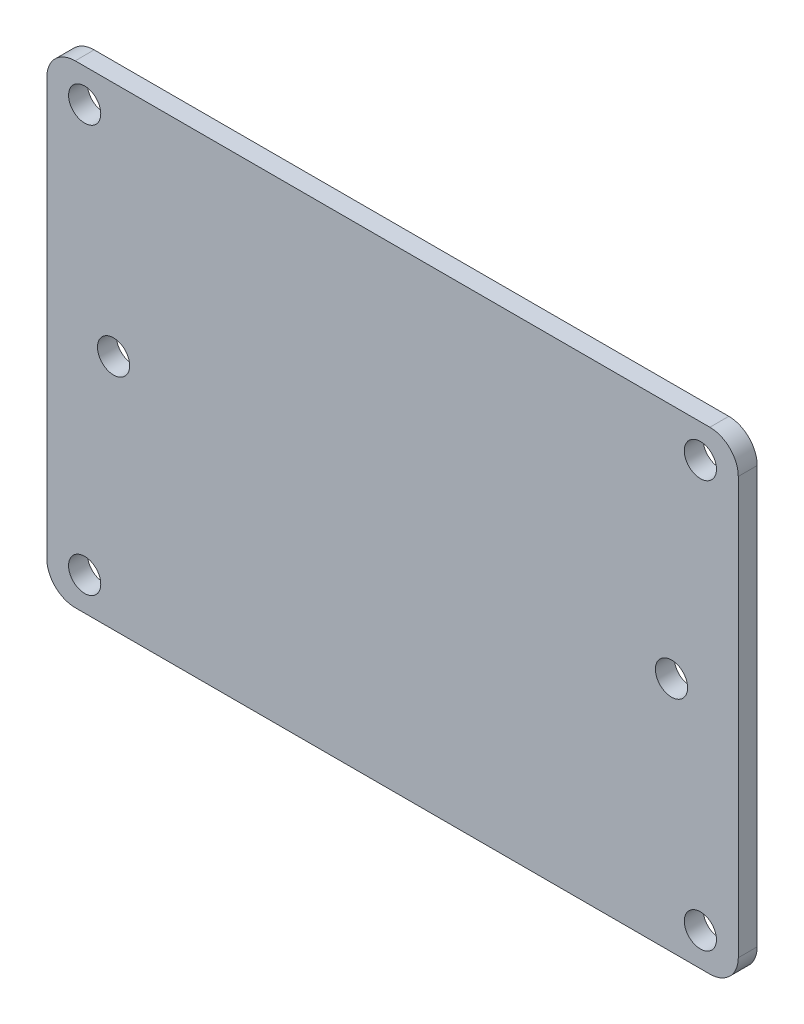
ISO-10303-21;
HEADER;
FILE_DESCRIPTION(('STEP AP214'),'2;1');
FILE_NAME('part.step','',(''),(''),'','','');
FILE_SCHEMA(('AUTOMOTIVE_DESIGN { 1 0 10303 214 1 1 1 1 }'));
ENDSEC;
DATA;
#1=APPLICATION_CONTEXT('core data for automotive mechanical design processes');
#2=APPLICATION_PROTOCOL_DEFINITION('international standard','automotive_design',2000,#1);
#3=PRODUCT_CONTEXT('',#1,'mechanical');
#4=PRODUCT('Part','Part','',(#3));
#5=PRODUCT_RELATED_PRODUCT_CATEGORY('part','',(#4));
#6=PRODUCT_DEFINITION_FORMATION('','',#4);
#7=PRODUCT_DEFINITION_CONTEXT('part definition',#1,'design');
#8=PRODUCT_DEFINITION('design','',#6,#7);
#9=PRODUCT_DEFINITION_SHAPE('','',#8);
#10=(LENGTH_UNIT() NAMED_UNIT(*) SI_UNIT(.MILLI.,.METRE.));
#11=(NAMED_UNIT(*) PLANE_ANGLE_UNIT() SI_UNIT($,.RADIAN.));
#12=(NAMED_UNIT(*) SI_UNIT($,.STERADIAN.) SOLID_ANGLE_UNIT());
#13=UNCERTAINTY_MEASURE_WITH_UNIT(LENGTH_MEASURE(1.E-05),#10,'distance_accuracy_value','');
#14=(GEOMETRIC_REPRESENTATION_CONTEXT(3) GLOBAL_UNCERTAINTY_ASSIGNED_CONTEXT((#13)) GLOBAL_UNIT_ASSIGNED_CONTEXT((#10,
#11,#12)) REPRESENTATION_CONTEXT('',''));
#15=CARTESIAN_POINT('',(0.,0.,0.));
#16=DIRECTION('',(0.,0.,1.));
#17=DIRECTION('',(1.,0.,0.));
#18=AXIS2_PLACEMENT_3D('',#15,#16,#17);
#19=CARTESIAN_POINT('',(-33.5,22.,2.));
#20=DIRECTION('',(0.,0.,1.));
#21=DIRECTION('',(1.,0.,0.));
#22=AXIS2_PLACEMENT_3D('',#19,#20,#21);
#23=PLANE('',#22);
#24=CARTESIAN_POINT('',(29.45,0.,2.));
#25=DIRECTION('',(0.,0.,1.));
#26=DIRECTION('',(1.,0.,0.));
#27=AXIS2_PLACEMENT_3D('',#24,#25,#26);
#28=CIRCLE('',#27,1.7);
#29=CARTESIAN_POINT('',(31.15,0.,2.));
#30=VERTEX_POINT('',#29);
#31=EDGE_CURVE('E224',#30,#30,#28,.F.);
#32=ORIENTED_EDGE('',*,*,#31,.T.);
#33=EDGE_LOOP('',(#32));
#34=FACE_BOUND('',#33,.T.);
#35=CARTESIAN_POINT('',(-29.45,0.,2.));
#36=DIRECTION('',(0.,0.,1.));
#37=DIRECTION('',(1.,0.,0.));
#38=AXIS2_PLACEMENT_3D('',#35,#36,#37);
#39=CIRCLE('',#38,1.7);
#40=CARTESIAN_POINT('',(-27.75,0.,2.));
#41=VERTEX_POINT('',#40);
#42=EDGE_CURVE('E221',#41,#41,#39,.F.);
#43=ORIENTED_EDGE('',*,*,#42,.T.);
#44=EDGE_LOOP('',(#43));
#45=FACE_BOUND('',#44,.T.);
#46=CARTESIAN_POINT('',(32.5,21.5,2.));
#47=DIRECTION('',(0.,0.,1.));
#48=DIRECTION('',(1.,0.,0.));
#49=AXIS2_PLACEMENT_3D('',#46,#47,#48);
#50=CIRCLE('',#49,1.7);
#51=CARTESIAN_POINT('',(34.2,21.5,2.));
#52=VERTEX_POINT('',#51);
#53=EDGE_CURVE('E212',#52,#52,#50,.T.);
#54=ORIENTED_EDGE('',*,*,#53,.F.);
#55=EDGE_LOOP('',(#54));
#56=FACE_BOUND('',#55,.T.);
#57=CARTESIAN_POINT('',(-32.5,21.5,2.));
#58=DIRECTION('',(0.,0.,1.));
#59=DIRECTION('',(1.,0.,0.));
#60=AXIS2_PLACEMENT_3D('',#57,#58,#59);
#61=CIRCLE('',#60,1.7);
#62=CARTESIAN_POINT('',(-30.8,21.5,2.));
#63=VERTEX_POINT('',#62);
#64=EDGE_CURVE('E206',#63,#63,#61,.T.);
#65=ORIENTED_EDGE('',*,*,#64,.F.);
#66=EDGE_LOOP('',(#65));
#67=FACE_BOUND('',#66,.T.);
#68=CARTESIAN_POINT('',(32.5,-21.5,2.));
#69=DIRECTION('',(0.,0.,1.));
#70=DIRECTION('',(1.,0.,0.));
#71=AXIS2_PLACEMENT_3D('',#68,#69,#70);
#72=CIRCLE('',#71,1.7);
#73=CARTESIAN_POINT('',(34.2,-21.5,2.));
#74=VERTEX_POINT('',#73);
#75=EDGE_CURVE('E197',#74,#74,#72,.T.);
#76=ORIENTED_EDGE('',*,*,#75,.F.);
#77=EDGE_LOOP('',(#76));
#78=FACE_BOUND('',#77,.T.);
#79=CARTESIAN_POINT('',(-33.5,22.,2.));
#80=DIRECTION('',(0.,0.,1.));
#81=DIRECTION('',(1.,0.,0.));
#82=AXIS2_PLACEMENT_3D('',#79,#80,#81);
#83=CIRCLE('',#82,3.);
#84=CARTESIAN_POINT('',(-33.5,25.,2.));
#85=VERTEX_POINT('',#84);
#86=CARTESIAN_POINT('',(-36.5,22.,2.));
#87=VERTEX_POINT('',#86);
#88=EDGE_CURVE('E160',#85,#87,#83,.T.);
#89=ORIENTED_EDGE('',*,*,#88,.T.);
#90=DIRECTION('',(0.,-1.,0.));
#91=VECTOR('',#90,1.);
#92=CARTESIAN_POINT('',(-36.5,22.,2.));
#93=LINE('',#92,#91);
#94=CARTESIAN_POINT('',(-36.5,-22.,2.));
#95=VERTEX_POINT('',#94);
#96=EDGE_CURVE('E108',#87,#95,#93,.T.);
#97=ORIENTED_EDGE('',*,*,#96,.T.);
#98=CARTESIAN_POINT('',(-33.5,-22.,2.));
#99=DIRECTION('',(0.,0.,1.));
#100=DIRECTION('',(-1.,0.,0.));
#101=AXIS2_PLACEMENT_3D('',#98,#99,#100);
#102=CIRCLE('',#101,3.);
#103=CARTESIAN_POINT('',(-33.5,-25.,2.));
#104=VERTEX_POINT('',#103);
#105=EDGE_CURVE('E175',#95,#104,#102,.T.);
#106=ORIENTED_EDGE('',*,*,#105,.T.);
#107=DIRECTION('',(1.,0.,0.));
#108=VECTOR('',#107,1.);
#109=CARTESIAN_POINT('',(-33.5,-25.,2.));
#110=LINE('',#109,#108);
#111=CARTESIAN_POINT('',(33.5,-25.,2.));
#112=VERTEX_POINT('',#111);
#113=EDGE_CURVE('E188',#104,#112,#110,.T.);
#114=ORIENTED_EDGE('',*,*,#113,.T.);
#115=CARTESIAN_POINT('',(33.5,-22.,2.));
#116=DIRECTION('',(0.,0.,1.));
#117=DIRECTION('',(-1.,0.,0.));
#118=AXIS2_PLACEMENT_3D('',#115,#116,#117);
#119=CIRCLE('',#118,3.00000000000001);
#120=CARTESIAN_POINT('',(36.5,-22.,2.));
#121=VERTEX_POINT('',#120);
#122=EDGE_CURVE('E127',#112,#121,#119,.T.);
#123=ORIENTED_EDGE('',*,*,#122,.T.);
#124=DIRECTION('',(0.,1.,0.));
#125=VECTOR('',#124,1.);
#126=CARTESIAN_POINT('',(36.5,22.,2.));
#127=LINE('',#126,#125);
#128=CARTESIAN_POINT('',(36.5,22.,2.));
#129=VERTEX_POINT('',#128);
#130=EDGE_CURVE('E121',#121,#129,#127,.T.);
#131=ORIENTED_EDGE('',*,*,#130,.T.);
#132=CARTESIAN_POINT('',(33.5,22.,2.));
#133=DIRECTION('',(0.,0.,1.));
#134=DIRECTION('',(-1.,0.,0.));
#135=AXIS2_PLACEMENT_3D('',#132,#133,#134);
#136=CIRCLE('',#135,2.99999999999999);
#137=CARTESIAN_POINT('',(33.5,25.,2.));
#138=VERTEX_POINT('',#137);
#139=EDGE_CURVE('E125',#129,#138,#136,.T.);
#140=ORIENTED_EDGE('',*,*,#139,.T.);
#141=DIRECTION('',(-1.,0.,0.));
#142=VECTOR('',#141,1.);
#143=CARTESIAN_POINT('',(-33.5,25.,2.));
#144=LINE('',#143,#142);
#145=EDGE_CURVE('E65',#138,#85,#144,.T.);
#146=ORIENTED_EDGE('',*,*,#145,.T.);
#147=EDGE_LOOP('',(#89,#97,#106,#114,#123,#131,#140,#146));
#148=FACE_BOUND('',#147,.T.);
#149=CARTESIAN_POINT('',(-32.5,-21.5,2.));
#150=DIRECTION('',(0.,0.,1.));
#151=DIRECTION('',(1.,0.,0.));
#152=AXIS2_PLACEMENT_3D('',#149,#150,#151);
#153=CIRCLE('',#152,1.7);
#154=CARTESIAN_POINT('',(-30.8,-21.5,2.));
#155=VERTEX_POINT('',#154);
#156=EDGE_CURVE('E149',#155,#155,#153,.T.);
#157=ORIENTED_EDGE('',*,*,#156,.F.);
#158=EDGE_LOOP('',(#157));
#159=FACE_BOUND('',#158,.T.);
#160=ADVANCED_FACE('F47',(#34,#45,#56,#67,#78,#148,#159),#23,.T.);
#161=CARTESIAN_POINT('',(-33.5,22.,0.));
#162=DIRECTION('',(0.,0.,1.));
#163=DIRECTION('',(1.,0.,0.));
#164=AXIS2_PLACEMENT_3D('',#161,#162,#163);
#165=PLANE('',#164);
#166=CARTESIAN_POINT('',(29.45,0.,0.));
#167=DIRECTION('',(0.,0.,-1.));
#168=DIRECTION('',(-1.,0.,0.));
#169=AXIS2_PLACEMENT_3D('',#166,#167,#168);
#170=CIRCLE('',#169,1.7);
#171=CARTESIAN_POINT('',(27.75,0.,0.));
#172=VERTEX_POINT('',#171);
#173=EDGE_CURVE('E215',#172,#172,#170,.T.);
#174=ORIENTED_EDGE('',*,*,#173,.F.);
#175=EDGE_LOOP('',(#174));
#176=FACE_BOUND('',#175,.T.);
#177=CARTESIAN_POINT('',(-29.45,0.,0.));
#178=DIRECTION('',(0.,0.,-1.));
#179=DIRECTION('',(-1.,0.,0.));
#180=AXIS2_PLACEMENT_3D('',#177,#178,#179);
#181=CIRCLE('',#180,1.7);
#182=CARTESIAN_POINT('',(-31.15,0.,0.));
#183=VERTEX_POINT('',#182);
#184=EDGE_CURVE('E218',#183,#183,#181,.T.);
#185=ORIENTED_EDGE('',*,*,#184,.F.);
#186=EDGE_LOOP('',(#185));
#187=FACE_BOUND('',#186,.T.);
#188=CARTESIAN_POINT('',(32.5,21.5,0.));
#189=DIRECTION('',(0.,0.,1.));
#190=DIRECTION('',(1.,0.,0.));
#191=AXIS2_PLACEMENT_3D('',#188,#189,#190);
#192=CIRCLE('',#191,1.7);
#193=CARTESIAN_POINT('',(34.2,21.5,0.));
#194=VERTEX_POINT('',#193);
#195=EDGE_CURVE('E209',#194,#194,#192,.T.);
#196=ORIENTED_EDGE('',*,*,#195,.T.);
#197=EDGE_LOOP('',(#196));
#198=FACE_BOUND('',#197,.T.);
#199=CARTESIAN_POINT('',(-32.5,21.5,0.));
#200=DIRECTION('',(0.,0.,1.));
#201=DIRECTION('',(1.,0.,0.));
#202=AXIS2_PLACEMENT_3D('',#199,#200,#201);
#203=CIRCLE('',#202,1.7);
#204=CARTESIAN_POINT('',(-30.8,21.5,0.));
#205=VERTEX_POINT('',#204);
#206=EDGE_CURVE('E205',#205,#205,#203,.T.);
#207=ORIENTED_EDGE('',*,*,#206,.T.);
#208=EDGE_LOOP('',(#207));
#209=FACE_BOUND('',#208,.T.);
#210=CARTESIAN_POINT('',(32.5,-21.5,0.));
#211=DIRECTION('',(0.,0.,1.));
#212=DIRECTION('',(1.,0.,0.));
#213=AXIS2_PLACEMENT_3D('',#210,#211,#212);
#214=CIRCLE('',#213,1.7);
#215=CARTESIAN_POINT('',(34.2,-21.5,0.));
#216=VERTEX_POINT('',#215);
#217=EDGE_CURVE('E202',#216,#216,#214,.T.);
#218=ORIENTED_EDGE('',*,*,#217,.T.);
#219=EDGE_LOOP('',(#218));
#220=FACE_BOUND('',#219,.T.);
#221=CARTESIAN_POINT('',(-33.5,22.,0.));
#222=DIRECTION('',(0.,0.,1.));
#223=DIRECTION('',(1.,0.,0.));
#224=AXIS2_PLACEMENT_3D('',#221,#222,#223);
#225=CIRCLE('',#224,3.);
#226=CARTESIAN_POINT('',(-33.5,25.,0.));
#227=VERTEX_POINT('',#226);
#228=CARTESIAN_POINT('',(-36.5,22.,0.));
#229=VERTEX_POINT('',#228);
#230=EDGE_CURVE('E145',#227,#229,#225,.T.);
#231=ORIENTED_EDGE('',*,*,#230,.F.);
#232=DIRECTION('',(-1.,0.,0.));
#233=VECTOR('',#232,1.);
#234=CARTESIAN_POINT('',(-33.5,25.,0.));
#235=LINE('',#234,#233);
#236=CARTESIAN_POINT('',(33.5,25.,0.));
#237=VERTEX_POINT('',#236);
#238=EDGE_CURVE('E100',#237,#227,#235,.T.);
#239=ORIENTED_EDGE('',*,*,#238,.F.);
#240=CARTESIAN_POINT('',(33.5,22.,0.));
#241=DIRECTION('',(0.,0.,1.));
#242=DIRECTION('',(-1.,0.,0.));
#243=AXIS2_PLACEMENT_3D('',#240,#241,#242);
#244=CIRCLE('',#243,2.99999999999999);
#245=CARTESIAN_POINT('',(36.5,22.,0.));
#246=VERTEX_POINT('',#245);
#247=EDGE_CURVE('E94',#246,#237,#244,.T.);
#248=ORIENTED_EDGE('',*,*,#247,.F.);
#249=DIRECTION('',(0.,1.,0.));
#250=VECTOR('',#249,1.);
#251=CARTESIAN_POINT('',(36.5,22.,0.));
#252=LINE('',#251,#250);
#253=CARTESIAN_POINT('',(36.5,-22.,0.));
#254=VERTEX_POINT('',#253);
#255=EDGE_CURVE('E135',#254,#246,#252,.T.);
#256=ORIENTED_EDGE('',*,*,#255,.F.);
#257=CARTESIAN_POINT('',(33.5,-22.,0.));
#258=DIRECTION('',(0.,0.,1.));
#259=DIRECTION('',(-1.,0.,0.));
#260=AXIS2_PLACEMENT_3D('',#257,#258,#259);
#261=CIRCLE('',#260,3.00000000000001);
#262=CARTESIAN_POINT('',(33.5,-25.,0.));
#263=VERTEX_POINT('',#262);
#264=EDGE_CURVE('E155',#263,#254,#261,.T.);
#265=ORIENTED_EDGE('',*,*,#264,.F.);
#266=DIRECTION('',(1.,0.,0.));
#267=VECTOR('',#266,1.);
#268=CARTESIAN_POINT('',(-33.5,-25.,0.));
#269=LINE('',#268,#267);
#270=CARTESIAN_POINT('',(-33.5,-25.,0.));
#271=VERTEX_POINT('',#270);
#272=EDGE_CURVE('E153',#271,#263,#269,.T.);
#273=ORIENTED_EDGE('',*,*,#272,.F.);
#274=CARTESIAN_POINT('',(-33.5,-22.,0.));
#275=DIRECTION('',(0.,0.,1.));
#276=DIRECTION('',(-1.,0.,0.));
#277=AXIS2_PLACEMENT_3D('',#274,#275,#276);
#278=CIRCLE('',#277,3.);
#279=CARTESIAN_POINT('',(-36.5,-22.,0.));
#280=VERTEX_POINT('',#279);
#281=EDGE_CURVE('E151',#280,#271,#278,.T.);
#282=ORIENTED_EDGE('',*,*,#281,.F.);
#283=DIRECTION('',(0.,-1.,0.));
#284=VECTOR('',#283,1.);
#285=CARTESIAN_POINT('',(-36.5,22.,0.));
#286=LINE('',#285,#284);
#287=EDGE_CURVE('E148',#229,#280,#286,.T.);
#288=ORIENTED_EDGE('',*,*,#287,.F.);
#289=EDGE_LOOP('',(#231,#239,#248,#256,#265,#273,#282,#288));
#290=FACE_BOUND('',#289,.T.);
#291=CARTESIAN_POINT('',(-32.5,-21.5,0.));
#292=DIRECTION('',(0.,0.,1.));
#293=DIRECTION('',(1.,0.,0.));
#294=AXIS2_PLACEMENT_3D('',#291,#292,#293);
#295=CIRCLE('',#294,1.7);
#296=CARTESIAN_POINT('',(-30.8,-21.5,0.));
#297=VERTEX_POINT('',#296);
#298=EDGE_CURVE('E194',#297,#297,#295,.T.);
#299=ORIENTED_EDGE('',*,*,#298,.T.);
#300=EDGE_LOOP('',(#299));
#301=FACE_BOUND('',#300,.T.);
#302=ADVANCED_FACE('F179',(#176,#187,#198,#209,#220,#290,#301),#165,.F.);
#303=CARTESIAN_POINT('',(-33.5,22.,2.));
#304=DIRECTION('',(0.,0.,-1.));
#305=DIRECTION('',(-1.,0.,0.));
#306=AXIS2_PLACEMENT_3D('',#303,#304,#305);
#307=CYLINDRICAL_SURFACE('',#306,3.);
#308=ORIENTED_EDGE('',*,*,#230,.T.);
#309=DIRECTION('',(0.,0.,-1.));
#310=VECTOR('',#309,1.);
#311=CARTESIAN_POINT('',(-36.5,22.,2.));
#312=LINE('',#311,#310);
#313=EDGE_CURVE('E11',#87,#229,#312,.T.);
#314=ORIENTED_EDGE('',*,*,#313,.F.);
#315=ORIENTED_EDGE('',*,*,#88,.F.);
#316=DIRECTION('',(0.,0.,-1.));
#317=VECTOR('',#316,1.);
#318=CARTESIAN_POINT('',(-33.5,25.,2.));
#319=LINE('',#318,#317);
#320=EDGE_CURVE('E141',#85,#227,#319,.T.);
#321=ORIENTED_EDGE('',*,*,#320,.T.);
#322=EDGE_LOOP('',(#308,#314,#315,#321));
#323=FACE_BOUND('',#322,.T.);
#324=ADVANCED_FACE('F50',(#323),#307,.T.);
#325=CARTESIAN_POINT('',(-36.5,22.,2.));
#326=DIRECTION('',(1.,0.,0.));
#327=DIRECTION('',(0.,0.,-1.));
#328=AXIS2_PLACEMENT_3D('',#325,#326,#327);
#329=PLANE('',#328);
#330=ORIENTED_EDGE('',*,*,#287,.T.);
#331=DIRECTION('',(0.,0.,-1.));
#332=VECTOR('',#331,1.);
#333=CARTESIAN_POINT('',(-36.5,-22.,2.));
#334=LINE('',#333,#332);
#335=EDGE_CURVE('E57',#95,#280,#334,.T.);
#336=ORIENTED_EDGE('',*,*,#335,.F.);
#337=ORIENTED_EDGE('',*,*,#96,.F.);
#338=ORIENTED_EDGE('',*,*,#313,.T.);
#339=EDGE_LOOP('',(#330,#336,#337,#338));
#340=FACE_BOUND('',#339,.T.);
#341=ADVANCED_FACE('F286',(#340),#329,.F.);
#342=CARTESIAN_POINT('',(-33.5,-22.,2.));
#343=DIRECTION('',(0.,0.,-1.));
#344=DIRECTION('',(-1.,0.,0.));
#345=AXIS2_PLACEMENT_3D('',#342,#343,#344);
#346=CYLINDRICAL_SURFACE('',#345,3.);
#347=ORIENTED_EDGE('',*,*,#281,.T.);
#348=DIRECTION('',(0.,0.,-1.));
#349=VECTOR('',#348,1.);
#350=CARTESIAN_POINT('',(-33.5,-25.,2.));
#351=LINE('',#350,#349);
#352=EDGE_CURVE('E167',#104,#271,#351,.T.);
#353=ORIENTED_EDGE('',*,*,#352,.F.);
#354=ORIENTED_EDGE('',*,*,#105,.F.);
#355=ORIENTED_EDGE('',*,*,#335,.T.);
#356=EDGE_LOOP('',(#347,#353,#354,#355));
#357=FACE_BOUND('',#356,.T.);
#358=ADVANCED_FACE('F173',(#357),#346,.T.);
#359=CARTESIAN_POINT('',(-33.5,-25.,2.));
#360=DIRECTION('',(0.,1.,0.));
#361=DIRECTION('',(0.,0.,1.));
#362=AXIS2_PLACEMENT_3D('',#359,#360,#361);
#363=PLANE('',#362);
#364=ORIENTED_EDGE('',*,*,#272,.T.);
#365=DIRECTION('',(0.,0.,-1.));
#366=VECTOR('',#365,1.);
#367=CARTESIAN_POINT('',(33.5,-25.,2.));
#368=LINE('',#367,#366);
#369=EDGE_CURVE('E164',#112,#263,#368,.T.);
#370=ORIENTED_EDGE('',*,*,#369,.F.);
#371=ORIENTED_EDGE('',*,*,#113,.F.);
#372=ORIENTED_EDGE('',*,*,#352,.T.);
#373=EDGE_LOOP('',(#364,#370,#371,#372));
#374=FACE_BOUND('',#373,.T.);
#375=ADVANCED_FACE('F184',(#374),#363,.F.);
#376=CARTESIAN_POINT('',(33.5,-22.,2.));
#377=DIRECTION('',(0.,0.,-1.));
#378=DIRECTION('',(-1.,0.,0.));
#379=AXIS2_PLACEMENT_3D('',#376,#377,#378);
#380=CYLINDRICAL_SURFACE('',#379,3.00000000000001);
#381=ORIENTED_EDGE('',*,*,#264,.T.);
#382=DIRECTION('',(0.,0.,-1.));
#383=VECTOR('',#382,1.);
#384=CARTESIAN_POINT('',(36.5,-22.,2.));
#385=LINE('',#384,#383);
#386=EDGE_CURVE('E136',#121,#254,#385,.T.);
#387=ORIENTED_EDGE('',*,*,#386,.F.);
#388=ORIENTED_EDGE('',*,*,#122,.F.);
#389=ORIENTED_EDGE('',*,*,#369,.T.);
#390=EDGE_LOOP('',(#381,#387,#388,#389));
#391=FACE_BOUND('',#390,.T.);
#392=ADVANCED_FACE('F187',(#391),#380,.T.);
#393=CARTESIAN_POINT('',(36.5,22.,2.));
#394=DIRECTION('',(-1.,0.,0.));
#395=DIRECTION('',(0.,-1.,0.));
#396=AXIS2_PLACEMENT_3D('',#393,#394,#395);
#397=PLANE('',#396);
#398=ORIENTED_EDGE('',*,*,#255,.T.);
#399=DIRECTION('',(0.,0.,-1.));
#400=VECTOR('',#399,1.);
#401=CARTESIAN_POINT('',(36.5,22.,2.));
#402=LINE('',#401,#400);
#403=EDGE_CURVE('E132',#129,#246,#402,.T.);
#404=ORIENTED_EDGE('',*,*,#403,.F.);
#405=ORIENTED_EDGE('',*,*,#130,.F.);
#406=ORIENTED_EDGE('',*,*,#386,.T.);
#407=EDGE_LOOP('',(#398,#404,#405,#406));
#408=FACE_BOUND('',#407,.T.);
#409=ADVANCED_FACE('F133',(#408),#397,.F.);
#410=CARTESIAN_POINT('',(33.5,22.,2.));
#411=DIRECTION('',(0.,0.,-1.));
#412=DIRECTION('',(-1.,0.,0.));
#413=AXIS2_PLACEMENT_3D('',#410,#411,#412);
#414=CYLINDRICAL_SURFACE('',#413,2.99999999999999);
#415=ORIENTED_EDGE('',*,*,#247,.T.);
#416=DIRECTION('',(0.,0.,-1.));
#417=VECTOR('',#416,1.);
#418=CARTESIAN_POINT('',(33.5,25.,2.));
#419=LINE('',#418,#417);
#420=EDGE_CURVE('E137',#138,#237,#419,.T.);
#421=ORIENTED_EDGE('',*,*,#420,.F.);
#422=ORIENTED_EDGE('',*,*,#139,.F.);
#423=ORIENTED_EDGE('',*,*,#403,.T.);
#424=EDGE_LOOP('',(#415,#421,#422,#423));
#425=FACE_BOUND('',#424,.T.);
#426=ADVANCED_FACE('F139',(#425),#414,.T.);
#427=CARTESIAN_POINT('',(-33.5,25.,2.));
#428=DIRECTION('',(0.,-1.,0.));
#429=DIRECTION('',(0.,0.,-1.));
#430=AXIS2_PLACEMENT_3D('',#427,#428,#429);
#431=PLANE('',#430);
#432=ORIENTED_EDGE('',*,*,#238,.T.);
#433=ORIENTED_EDGE('',*,*,#320,.F.);
#434=ORIENTED_EDGE('',*,*,#145,.F.);
#435=ORIENTED_EDGE('',*,*,#420,.T.);
#436=EDGE_LOOP('',(#432,#433,#434,#435));
#437=FACE_BOUND('',#436,.T.);
#438=ADVANCED_FACE('F255',(#437),#431,.F.);
#439=CARTESIAN_POINT('',(-32.5,-21.5,2.));
#440=DIRECTION('',(0.,0.,-1.));
#441=DIRECTION('',(-1.,0.,0.));
#442=AXIS2_PLACEMENT_3D('',#439,#440,#441);
#443=CYLINDRICAL_SURFACE('',#442,1.7);
#444=ORIENTED_EDGE('',*,*,#156,.T.);
#445=EDGE_LOOP('',(#444));
#446=FACE_BOUND('',#445,.T.);
#447=ORIENTED_EDGE('',*,*,#298,.F.);
#448=EDGE_LOOP('',(#447));
#449=FACE_BOUND('',#448,.T.);
#450=ADVANCED_FACE('F246',(#446,#449),#443,.F.);
#451=CARTESIAN_POINT('',(32.5,-21.5,2.001));
#452=DIRECTION('',(0.,0.,-1.));
#453=DIRECTION('',(-1.,0.,0.));
#454=AXIS2_PLACEMENT_3D('',#451,#452,#453);
#455=CYLINDRICAL_SURFACE('',#454,1.7);
#456=ORIENTED_EDGE('',*,*,#75,.T.);
#457=EDGE_LOOP('',(#456));
#458=FACE_BOUND('',#457,.T.);
#459=ORIENTED_EDGE('',*,*,#217,.F.);
#460=EDGE_LOOP('',(#459));
#461=FACE_BOUND('',#460,.T.);
#462=ADVANCED_FACE('F243',(#458,#461),#455,.F.);
#463=CARTESIAN_POINT('',(-32.5,21.5,0.));
#464=DIRECTION('',(0.,0.,1.));
#465=DIRECTION('',(1.,0.,0.));
#466=AXIS2_PLACEMENT_3D('',#463,#464,#465);
#467=CYLINDRICAL_SURFACE('',#466,1.7);
#468=ORIENTED_EDGE('',*,*,#206,.F.);
#469=EDGE_LOOP('',(#468));
#470=FACE_BOUND('',#469,.T.);
#471=ORIENTED_EDGE('',*,*,#64,.T.);
#472=EDGE_LOOP('',(#471));
#473=FACE_BOUND('',#472,.T.);
#474=ADVANCED_FACE('F245',(#470,#473),#467,.F.);
#475=CARTESIAN_POINT('',(32.5,21.5,0.));
#476=DIRECTION('',(0.,0.,1.));
#477=DIRECTION('',(1.,0.,0.));
#478=AXIS2_PLACEMENT_3D('',#475,#476,#477);
#479=CYLINDRICAL_SURFACE('',#478,1.7);
#480=ORIENTED_EDGE('',*,*,#195,.F.);
#481=EDGE_LOOP('',(#480));
#482=FACE_BOUND('',#481,.T.);
#483=ORIENTED_EDGE('',*,*,#53,.T.);
#484=EDGE_LOOP('',(#483));
#485=FACE_BOUND('',#484,.T.);
#486=ADVANCED_FACE('F252',(#482,#485),#479,.F.);
#487=CARTESIAN_POINT('',(-29.45,0.,2.001));
#488=DIRECTION('',(0.,0.,-1.));
#489=DIRECTION('',(-1.,0.,0.));
#490=AXIS2_PLACEMENT_3D('',#487,#488,#489);
#491=CYLINDRICAL_SURFACE('',#490,1.7);
#492=ORIENTED_EDGE('',*,*,#42,.F.);
#493=EDGE_LOOP('',(#492));
#494=FACE_BOUND('',#493,.T.);
#495=ORIENTED_EDGE('',*,*,#184,.T.);
#496=EDGE_LOOP('',(#495));
#497=FACE_BOUND('',#496,.T.);
#498=ADVANCED_FACE('F306',(#494,#497),#491,.F.);
#499=CARTESIAN_POINT('',(29.45,0.,2.001));
#500=DIRECTION('',(0.,0.,-1.));
#501=DIRECTION('',(-1.,0.,0.));
#502=AXIS2_PLACEMENT_3D('',#499,#500,#501);
#503=CYLINDRICAL_SURFACE('',#502,1.7);
#504=ORIENTED_EDGE('',*,*,#31,.F.);
#505=EDGE_LOOP('',(#504));
#506=FACE_BOUND('',#505,.T.);
#507=ORIENTED_EDGE('',*,*,#173,.T.);
#508=EDGE_LOOP('',(#507));
#509=FACE_BOUND('',#508,.T.);
#510=ADVANCED_FACE('F230',(#506,#509),#503,.F.);
#511=CLOSED_SHELL('',(#160,#302,#324,#341,#358,#375,#392,#409,#426,#438,#450,#462,#474,#486,
#498,#510));
#512=MANIFOLD_SOLID_BREP('B2',#511);
#513=ADVANCED_BREP_SHAPE_REPRESENTATION('',(#18,#512),#14);
#514=SHAPE_DEFINITION_REPRESENTATION(#9,#513);
ENDSEC;
END-ISO-10303-21;
